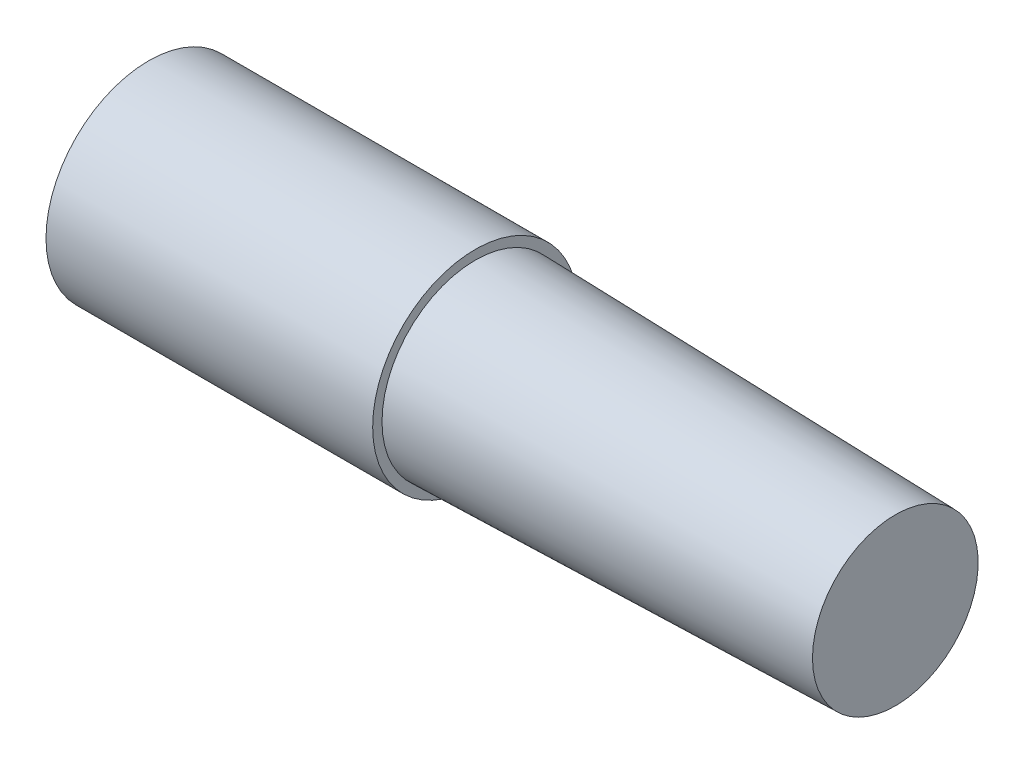
ISO-10303-21;
HEADER;
FILE_DESCRIPTION(('STEP AP214'),'2;1');
FILE_NAME('part.step','',(''),(''),'','','');
FILE_SCHEMA(('AUTOMOTIVE_DESIGN { 1 0 10303 214 1 1 1 1 }'));
ENDSEC;
DATA;
#1=APPLICATION_CONTEXT('core data for automotive mechanical design processes');
#2=APPLICATION_PROTOCOL_DEFINITION('international standard','automotive_design',2000,#1);
#3=PRODUCT_CONTEXT('',#1,'mechanical');
#4=PRODUCT('Part','Part','',(#3));
#5=PRODUCT_RELATED_PRODUCT_CATEGORY('part','',(#4));
#6=PRODUCT_DEFINITION_FORMATION('','',#4);
#7=PRODUCT_DEFINITION_CONTEXT('part definition',#1,'design');
#8=PRODUCT_DEFINITION('design','',#6,#7);
#9=PRODUCT_DEFINITION_SHAPE('','',#8);
#10=(LENGTH_UNIT() NAMED_UNIT(*) SI_UNIT(.MILLI.,.METRE.));
#11=(NAMED_UNIT(*) PLANE_ANGLE_UNIT() SI_UNIT($,.RADIAN.));
#12=(NAMED_UNIT(*) SI_UNIT($,.STERADIAN.) SOLID_ANGLE_UNIT());
#13=UNCERTAINTY_MEASURE_WITH_UNIT(LENGTH_MEASURE(1.E-05),#10,'distance_accuracy_value','');
#14=(GEOMETRIC_REPRESENTATION_CONTEXT(3) GLOBAL_UNCERTAINTY_ASSIGNED_CONTEXT((#13)) GLOBAL_UNIT_ASSIGNED_CONTEXT((#10,
#11,#12)) REPRESENTATION_CONTEXT('',''));
#15=CARTESIAN_POINT('',(0.,0.,0.));
#16=DIRECTION('',(0.,0.,1.));
#17=DIRECTION('',(1.,0.,0.));
#18=AXIS2_PLACEMENT_3D('',#15,#16,#17);
#19=CARTESIAN_POINT('',(80.,8.875,0.));
#20=DIRECTION('',(-1.,0.,0.));
#21=DIRECTION('',(0.,0.,1.));
#22=AXIS2_PLACEMENT_3D('',#19,#20,#21);
#23=PLANE('',#22);
#24=CARTESIAN_POINT('',(80.,0.,0.));
#25=DIRECTION('',(-1.,0.,0.));
#26=DIRECTION('',(0.,0.,1.));
#27=AXIS2_PLACEMENT_3D('',#24,#25,#26);
#28=CIRCLE('',#27,8.875);
#29=CARTESIAN_POINT('',(80.,0.,8.875));
#30=VERTEX_POINT('',#29);
#31=EDGE_CURVE('E72',#30,#30,#28,.T.);
#32=ORIENTED_EDGE('',*,*,#31,.F.);
#33=EDGE_LOOP('',(#32));
#34=FACE_BOUND('',#33,.T.);
#35=ADVANCED_FACE('F45',(#34),#23,.F.);
#36=CARTESIAN_POINT('',(0.,0.,0.));
#37=DIRECTION('',(1.,0.,0.));
#38=DIRECTION('',(0.,0.,-1.));
#39=AXIS2_PLACEMENT_3D('',#36,#37,#38);
#40=CONICAL_SURFACE('',#39,11.,1.0471975511966);
#41=CARTESIAN_POINT('',(-6.35085296108579,0.,0.));
#42=VERTEX_POINT('',#41);
#43=VERTEX_LOOP('',#42);
#44=FACE_BOUND('',#43,.T.);
#45=CARTESIAN_POINT('',(0.,0.,0.));
#46=DIRECTION('',(-1.,0.,0.));
#47=DIRECTION('',(0.,0.,1.));
#48=AXIS2_PLACEMENT_3D('',#45,#46,#47);
#49=CIRCLE('',#48,11.);
#50=CARTESIAN_POINT('',(0.,0.,11.));
#51=VERTEX_POINT('',#50);
#52=EDGE_CURVE('E11',#51,#51,#49,.T.);
#53=ORIENTED_EDGE('',*,*,#52,.T.);
#54=EDGE_LOOP('',(#53));
#55=FACE_BOUND('',#54,.T.);
#56=ADVANCED_FACE('F55',(#44,#55),#40,.T.);
#57=CARTESIAN_POINT('',(0.,0.,0.));
#58=DIRECTION('',(-1.,0.,0.));
#59=DIRECTION('',(0.,0.,1.));
#60=AXIS2_PLACEMENT_3D('',#57,#58,#59);
#61=CYLINDRICAL_SURFACE('',#60,11.);
#62=ORIENTED_EDGE('',*,*,#52,.F.);
#63=EDGE_LOOP('',(#62));
#64=FACE_BOUND('',#63,.T.);
#65=CARTESIAN_POINT('',(35.,0.,0.));
#66=DIRECTION('',(-1.,0.,0.));
#67=DIRECTION('',(0.,0.,1.));
#68=AXIS2_PLACEMENT_3D('',#65,#66,#67);
#69=CIRCLE('',#68,11.);
#70=CARTESIAN_POINT('',(35.,0.,11.));
#71=VERTEX_POINT('',#70);
#72=EDGE_CURVE('E52',#71,#71,#69,.T.);
#73=ORIENTED_EDGE('',*,*,#72,.T.);
#74=EDGE_LOOP('',(#73));
#75=FACE_BOUND('',#74,.T.);
#76=ADVANCED_FACE('F58',(#64,#75),#61,.T.);
#77=CARTESIAN_POINT('',(35.,11.,0.));
#78=DIRECTION('',(-1.,0.,0.));
#79=DIRECTION('',(0.,0.,1.));
#80=AXIS2_PLACEMENT_3D('',#77,#78,#79);
#81=PLANE('',#80);
#82=ORIENTED_EDGE('',*,*,#72,.F.);
#83=EDGE_LOOP('',(#82));
#84=FACE_BOUND('',#83,.T.);
#85=CARTESIAN_POINT('',(35.,0.,0.));
#86=DIRECTION('',(-1.,0.,0.));
#87=DIRECTION('',(0.,0.,1.));
#88=AXIS2_PLACEMENT_3D('',#85,#86,#87);
#89=CIRCLE('',#88,10.);
#90=CARTESIAN_POINT('',(35.,0.,10.));
#91=VERTEX_POINT('',#90);
#92=EDGE_CURVE('E69',#91,#91,#89,.T.);
#93=ORIENTED_EDGE('',*,*,#92,.T.);
#94=EDGE_LOOP('',(#93));
#95=FACE_BOUND('',#94,.T.);
#96=ADVANCED_FACE('F63',(#84,#95),#81,.F.);
#97=CARTESIAN_POINT('',(80.,0.,0.));
#98=DIRECTION('',(-1.,0.,0.));
#99=DIRECTION('',(0.,0.,1.));
#100=AXIS2_PLACEMENT_3D('',#97,#98,#99);
#101=CONICAL_SURFACE('',#100,8.875,0.0249947936189202);
#102=ORIENTED_EDGE('',*,*,#92,.F.);
#103=EDGE_LOOP('',(#102));
#104=FACE_BOUND('',#103,.T.);
#105=ORIENTED_EDGE('',*,*,#31,.T.);
#106=EDGE_LOOP('',(#105));
#107=FACE_BOUND('',#106,.T.);
#108=ADVANCED_FACE('F79',(#104,#107),#101,.T.);
#109=CLOSED_SHELL('',(#35,#56,#76,#96,#108));
#110=MANIFOLD_SOLID_BREP('B2',#109);
#111=ADVANCED_BREP_SHAPE_REPRESENTATION('',(#18,#110),#14);
#112=SHAPE_DEFINITION_REPRESENTATION(#9,#111);
ENDSEC;
END-ISO-10303-21;
